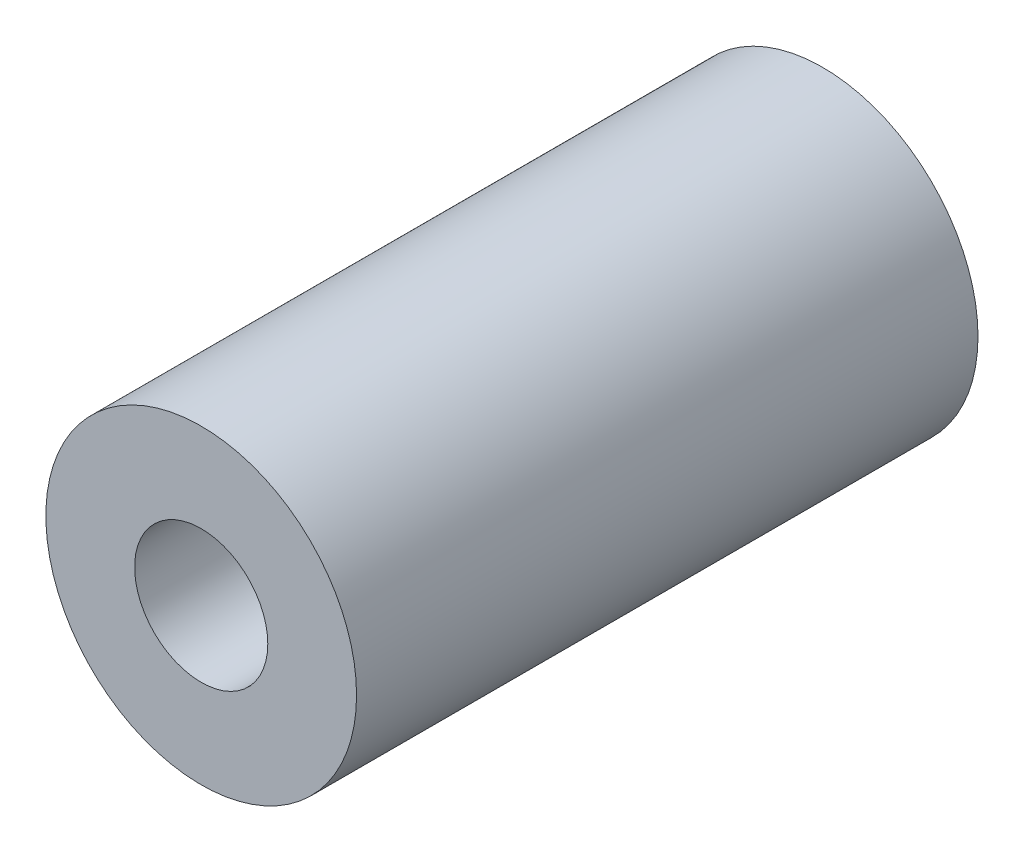
ISO-10303-21;
HEADER;
FILE_DESCRIPTION(('STEP AP214'),'2;1');
FILE_NAME('part.step','',(''),(''),'','','');
FILE_SCHEMA(('AUTOMOTIVE_DESIGN { 1 0 10303 214 1 1 1 1 }'));
ENDSEC;
DATA;
#1=APPLICATION_CONTEXT('core data for automotive mechanical design processes');
#2=APPLICATION_PROTOCOL_DEFINITION('international standard','automotive_design',2000,#1);
#3=PRODUCT_CONTEXT('',#1,'mechanical');
#4=PRODUCT('Part','Part','',(#3));
#5=PRODUCT_RELATED_PRODUCT_CATEGORY('part','',(#4));
#6=PRODUCT_DEFINITION_FORMATION('','',#4);
#7=PRODUCT_DEFINITION_CONTEXT('part definition',#1,'design');
#8=PRODUCT_DEFINITION('design','',#6,#7);
#9=PRODUCT_DEFINITION_SHAPE('','',#8);
#10=(LENGTH_UNIT() NAMED_UNIT(*) SI_UNIT(.MILLI.,.METRE.));
#11=(NAMED_UNIT(*) PLANE_ANGLE_UNIT() SI_UNIT($,.RADIAN.));
#12=(NAMED_UNIT(*) SI_UNIT($,.STERADIAN.) SOLID_ANGLE_UNIT());
#13=UNCERTAINTY_MEASURE_WITH_UNIT(LENGTH_MEASURE(1.E-05),#10,'distance_accuracy_value','');
#14=(GEOMETRIC_REPRESENTATION_CONTEXT(3) GLOBAL_UNCERTAINTY_ASSIGNED_CONTEXT((#13)) GLOBAL_UNIT_ASSIGNED_CONTEXT((#10,
#11,#12)) REPRESENTATION_CONTEXT('',''));
#15=CARTESIAN_POINT('',(0.,0.,0.));
#16=DIRECTION('',(0.,0.,1.));
#17=DIRECTION('',(1.,0.,0.));
#18=AXIS2_PLACEMENT_3D('',#15,#16,#17);
#19=CARTESIAN_POINT('',(79.9999914807469,72.6313970665055,14.));
#20=DIRECTION('',(0.,0.,1.));
#21=DIRECTION('',(1.,0.,0.));
#22=AXIS2_PLACEMENT_3D('',#19,#20,#21);
#23=PLANE('',#22);
#24=CARTESIAN_POINT('',(79.9999914807469,72.6313970665055,14.));
#25=DIRECTION('',(0.,0.,1.));
#26=DIRECTION('',(1.,0.,0.));
#27=AXIS2_PLACEMENT_3D('',#24,#25,#26);
#28=CIRCLE('',#27,3.49999810003459);
#29=CARTESIAN_POINT('',(83.4999895807815,72.6313970665055,14.));
#30=VERTEX_POINT('',#29);
#31=EDGE_CURVE('E11',#30,#30,#28,.T.);
#32=ORIENTED_EDGE('',*,*,#31,.T.);
#33=EDGE_LOOP('',(#32));
#34=FACE_BOUND('',#33,.T.);
#35=CARTESIAN_POINT('',(79.9999914807469,72.6313970665055,14.));
#36=DIRECTION('',(0.,0.,1.));
#37=DIRECTION('',(1.,0.,0.));
#38=AXIS2_PLACEMENT_3D('',#35,#36,#37);
#39=CIRCLE('',#38,1.49999810003459);
#40=CARTESIAN_POINT('',(81.4999895807815,72.6313970665055,14.));
#41=VERTEX_POINT('',#40);
#42=EDGE_CURVE('E47',#41,#41,#39,.T.);
#43=ORIENTED_EDGE('',*,*,#42,.F.);
#44=EDGE_LOOP('',(#43));
#45=FACE_BOUND('',#44,.T.);
#46=ADVANCED_FACE('F36',(#34,#45),#23,.T.);
#47=CARTESIAN_POINT('',(79.9999914807469,72.6313970665055,0.));
#48=DIRECTION('',(0.,0.,1.));
#49=DIRECTION('',(1.,0.,0.));
#50=AXIS2_PLACEMENT_3D('',#47,#48,#49);
#51=PLANE('',#50);
#52=CARTESIAN_POINT('',(79.9999914807469,72.6313970665055,0.));
#53=DIRECTION('',(0.,0.,1.));
#54=DIRECTION('',(1.,0.,0.));
#55=AXIS2_PLACEMENT_3D('',#52,#53,#54);
#56=CIRCLE('',#55,3.49999810003459);
#57=CARTESIAN_POINT('',(83.4999895807815,72.6313970665055,0.));
#58=VERTEX_POINT('',#57);
#59=EDGE_CURVE('E40',#58,#58,#56,.T.);
#60=ORIENTED_EDGE('',*,*,#59,.F.);
#61=EDGE_LOOP('',(#60));
#62=FACE_BOUND('',#61,.T.);
#63=CARTESIAN_POINT('',(79.9999914807469,72.6313970665055,0.));
#64=DIRECTION('',(0.,0.,1.));
#65=DIRECTION('',(1.,0.,0.));
#66=AXIS2_PLACEMENT_3D('',#63,#64,#65);
#67=CIRCLE('',#66,1.49999810003459);
#68=CARTESIAN_POINT('',(81.4999895807815,72.6313970665055,0.));
#69=VERTEX_POINT('',#68);
#70=EDGE_CURVE('E49',#69,#69,#67,.T.);
#71=ORIENTED_EDGE('',*,*,#70,.T.);
#72=EDGE_LOOP('',(#71));
#73=FACE_BOUND('',#72,.T.);
#74=ADVANCED_FACE('F59',(#62,#73),#51,.F.);
#75=CARTESIAN_POINT('',(79.9999914807469,72.6313970665055,14.));
#76=DIRECTION('',(0.,0.,-1.));
#77=DIRECTION('',(-1.,0.,0.));
#78=AXIS2_PLACEMENT_3D('',#75,#76,#77);
#79=CYLINDRICAL_SURFACE('',#78,3.49999810003459);
#80=ORIENTED_EDGE('',*,*,#31,.F.);
#81=EDGE_LOOP('',(#80));
#82=FACE_BOUND('',#81,.T.);
#83=ORIENTED_EDGE('',*,*,#59,.T.);
#84=EDGE_LOOP('',(#83));
#85=FACE_BOUND('',#84,.T.);
#86=ADVANCED_FACE('F38',(#82,#85),#79,.T.);
#87=CARTESIAN_POINT('',(79.9999914807469,72.6313970665055,14.));
#88=DIRECTION('',(0.,0.,-1.));
#89=DIRECTION('',(-1.,0.,0.));
#90=AXIS2_PLACEMENT_3D('',#87,#88,#89);
#91=CYLINDRICAL_SURFACE('',#90,1.49999810003459);
#92=ORIENTED_EDGE('',*,*,#42,.T.);
#93=EDGE_LOOP('',(#92));
#94=FACE_BOUND('',#93,.T.);
#95=ORIENTED_EDGE('',*,*,#70,.F.);
#96=EDGE_LOOP('',(#95));
#97=FACE_BOUND('',#96,.T.);
#98=ADVANCED_FACE('F55',(#94,#97),#91,.F.);
#99=CLOSED_SHELL('',(#46,#74,#86,#98));
#100=MANIFOLD_SOLID_BREP('B2',#99);
#101=ADVANCED_BREP_SHAPE_REPRESENTATION('',(#18,#100),#14);
#102=SHAPE_DEFINITION_REPRESENTATION(#9,#101);
ENDSEC;
END-ISO-10303-21;
